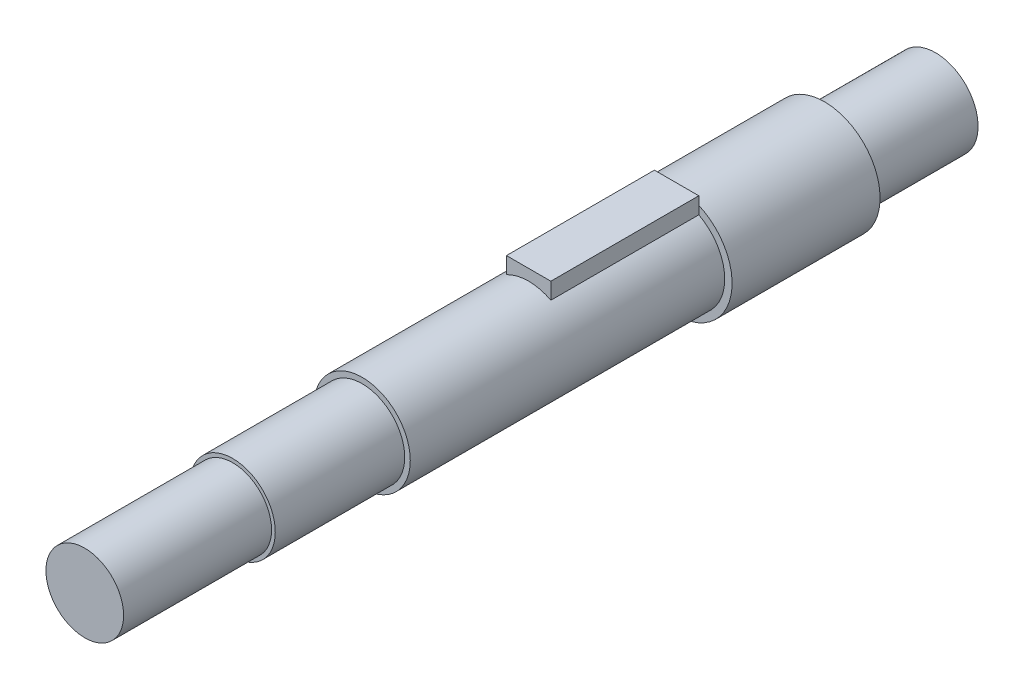
ISO-10303-21;
HEADER;
FILE_DESCRIPTION(('STEP AP214'),'2;1');
FILE_NAME('part.step','',(''),(''),'','','');
FILE_SCHEMA(('AUTOMOTIVE_DESIGN { 1 0 10303 214 1 1 1 1 }'));
ENDSEC;
DATA;
#1=APPLICATION_CONTEXT('core data for automotive mechanical design processes');
#2=APPLICATION_PROTOCOL_DEFINITION('international standard','automotive_design',2000,#1);
#3=PRODUCT_CONTEXT('',#1,'mechanical');
#4=PRODUCT('Part','Part','',(#3));
#5=PRODUCT_RELATED_PRODUCT_CATEGORY('part','',(#4));
#6=PRODUCT_DEFINITION_FORMATION('','',#4);
#7=PRODUCT_DEFINITION_CONTEXT('part definition',#1,'design');
#8=PRODUCT_DEFINITION('design','',#6,#7);
#9=PRODUCT_DEFINITION_SHAPE('','',#8);
#10=(LENGTH_UNIT() NAMED_UNIT(*) SI_UNIT(.MILLI.,.METRE.));
#11=(NAMED_UNIT(*) PLANE_ANGLE_UNIT() SI_UNIT($,.RADIAN.));
#12=(NAMED_UNIT(*) SI_UNIT($,.STERADIAN.) SOLID_ANGLE_UNIT());
#13=UNCERTAINTY_MEASURE_WITH_UNIT(LENGTH_MEASURE(1.E-05),#10,'distance_accuracy_value','');
#14=(GEOMETRIC_REPRESENTATION_CONTEXT(3) GLOBAL_UNCERTAINTY_ASSIGNED_CONTEXT((#13)) GLOBAL_UNIT_ASSIGNED_CONTEXT((#10,
#11,#12)) REPRESENTATION_CONTEXT('',''));
#15=CARTESIAN_POINT('',(0.,0.,0.));
#16=DIRECTION('',(0.,0.,1.));
#17=DIRECTION('',(1.,0.,0.));
#18=AXIS2_PLACEMENT_3D('',#15,#16,#17);
#19=CARTESIAN_POINT('',(0.,0.,70.));
#20=DIRECTION('',(0.,0.,1.));
#21=DIRECTION('',(1.,0.,0.));
#22=AXIS2_PLACEMENT_3D('',#19,#20,#21);
#23=CYLINDRICAL_SURFACE('',#22,13.);
#24=CARTESIAN_POINT('',(0.,0.,155.));
#25=DIRECTION('',(0.,0.,1.));
#26=DIRECTION('',(1.,0.,0.));
#27=AXIS2_PLACEMENT_3D('',#24,#25,#26);
#28=CIRCLE('',#27,13.);
#29=CARTESIAN_POINT('',(13.,0.,155.));
#30=VERTEX_POINT('',#29);
#31=EDGE_CURVE('E173',#30,#30,#28,.T.);
#32=ORIENTED_EDGE('',*,*,#31,.F.);
#33=EDGE_LOOP('',(#32));
#34=FACE_BOUND('',#33,.T.);
#35=CARTESIAN_POINT('',(0.,0.,110.));
#36=DIRECTION('',(0.,0.,-1.));
#37=DIRECTION('',(1.,0.,0.));
#38=AXIS2_PLACEMENT_3D('',#35,#36,#37);
#39=CIRCLE('',#38,13.);
#40=CARTESIAN_POINT('',(-6.,11.5325625946708,110.));
#41=VERTEX_POINT('',#40);
#42=CARTESIAN_POINT('',(6.,11.5325625946708,110.));
#43=VERTEX_POINT('',#42);
#44=EDGE_CURVE('E102',#41,#43,#39,.T.);
#45=ORIENTED_EDGE('',*,*,#44,.F.);
#46=DIRECTION('',(0.,0.,-1.));
#47=VECTOR('',#46,1.);
#48=CARTESIAN_POINT('',(-6.,11.5325625946708,110.));
#49=LINE('',#48,#47);
#50=CARTESIAN_POINT('',(-6.,11.5325625946708,70.));
#51=VERTEX_POINT('',#50);
#52=EDGE_CURVE('E112',#41,#51,#49,.T.);
#53=ORIENTED_EDGE('',*,*,#52,.T.);
#54=CARTESIAN_POINT('',(0.,0.,70.));
#55=DIRECTION('',(0.,0.,1.));
#56=DIRECTION('',(1.,0.,0.));
#57=AXIS2_PLACEMENT_3D('',#54,#55,#56);
#58=CIRCLE('',#57,13.);
#59=CARTESIAN_POINT('',(6.,11.5325625946708,70.));
#60=VERTEX_POINT('',#59);
#61=EDGE_CURVE('E177',#51,#60,#58,.T.);
#62=ORIENTED_EDGE('',*,*,#61,.T.);
#63=DIRECTION('',(0.,0.,-1.));
#64=VECTOR('',#63,1.);
#65=CARTESIAN_POINT('',(6.,11.5325625946708,110.));
#66=LINE('',#65,#64);
#67=EDGE_CURVE('E65',#43,#60,#66,.T.);
#68=ORIENTED_EDGE('',*,*,#67,.F.);
#69=EDGE_LOOP('',(#45,#53,#62,#68));
#70=FACE_BOUND('',#69,.T.);
#71=ADVANCED_FACE('F49',(#34,#70),#23,.T.);
#72=CARTESIAN_POINT('',(0.,0.,70.));
#73=DIRECTION('',(0.,0.,1.));
#74=DIRECTION('',(1.,0.,0.));
#75=AXIS2_PLACEMENT_3D('',#72,#73,#74);
#76=PLANE('',#75);
#77=ORIENTED_EDGE('',*,*,#61,.F.);
#78=DIRECTION('',(0.,1.,0.));
#79=VECTOR('',#78,1.);
#80=CARTESIAN_POINT('',(-6.,0.,70.));
#81=LINE('',#80,#79);
#82=CARTESIAN_POINT('',(-6.,13.7477270848675,70.));
#83=VERTEX_POINT('',#82);
#84=EDGE_CURVE('E12',#51,#83,#81,.T.);
#85=ORIENTED_EDGE('',*,*,#84,.T.);
#86=CARTESIAN_POINT('',(0.,0.,70.));
#87=DIRECTION('',(0.,0.,1.));
#88=DIRECTION('',(1.,0.,0.));
#89=AXIS2_PLACEMENT_3D('',#86,#87,#88);
#90=CIRCLE('',#89,15.);
#91=CARTESIAN_POINT('',(6.,13.7477270848675,70.));
#92=VERTEX_POINT('',#91);
#93=EDGE_CURVE('E179',#83,#92,#90,.T.);
#94=ORIENTED_EDGE('',*,*,#93,.T.);
#95=DIRECTION('',(0.,1.,0.));
#96=VECTOR('',#95,1.);
#97=CARTESIAN_POINT('',(6.,16.,70.));
#98=LINE('',#97,#96);
#99=EDGE_CURVE('E133',#60,#92,#98,.T.);
#100=ORIENTED_EDGE('',*,*,#99,.F.);
#101=EDGE_LOOP('',(#77,#85,#94,#100));
#102=FACE_BOUND('',#101,.T.);
#103=ADVANCED_FACE('F185',(#102),#76,.T.);
#104=CARTESIAN_POINT('',(0.,0.,230.));
#105=DIRECTION('',(0.,0.,-1.));
#106=DIRECTION('',(-1.,0.,0.));
#107=AXIS2_PLACEMENT_3D('',#104,#105,#106);
#108=CYLINDRICAL_SURFACE('',#107,15.);
#109=EDGE_CURVE('E58',#92,#83,#90,.T.);
#110=ORIENTED_EDGE('',*,*,#109,.F.);
#111=ORIENTED_EDGE('',*,*,#93,.F.);
#112=EDGE_LOOP('',(#110,#111));
#113=FACE_BOUND('',#112,.T.);
#114=CARTESIAN_POINT('',(0.,0.,30.));
#115=DIRECTION('',(0.,0.,-1.));
#116=DIRECTION('',(-1.,0.,0.));
#117=AXIS2_PLACEMENT_3D('',#114,#115,#116);
#118=CIRCLE('',#117,15.);
#119=CARTESIAN_POINT('',(-15.,0.,30.));
#120=VERTEX_POINT('',#119);
#121=EDGE_CURVE('E150',#120,#120,#118,.T.);
#122=ORIENTED_EDGE('',*,*,#121,.F.);
#123=EDGE_LOOP('',(#122));
#124=FACE_BOUND('',#123,.T.);
#125=ADVANCED_FACE('F51',(#113,#124),#108,.T.);
#126=CARTESIAN_POINT('',(0.,0.,155.));
#127=DIRECTION('',(0.,0.,1.));
#128=DIRECTION('',(1.,0.,0.));
#129=AXIS2_PLACEMENT_3D('',#126,#127,#128);
#130=CYLINDRICAL_SURFACE('',#129,11.5);
#131=CARTESIAN_POINT('',(0.,0.,155.));
#132=DIRECTION('',(0.,0.,1.));
#133=DIRECTION('',(1.,0.,0.));
#134=AXIS2_PLACEMENT_3D('',#131,#132,#133);
#135=CIRCLE('',#134,11.5);
#136=CARTESIAN_POINT('',(11.5,0.,155.));
#137=VERTEX_POINT('',#136);
#138=EDGE_CURVE('E169',#137,#137,#135,.T.);
#139=ORIENTED_EDGE('',*,*,#138,.T.);
#140=EDGE_LOOP('',(#139));
#141=FACE_BOUND('',#140,.T.);
#142=CARTESIAN_POINT('',(0.,0.,190.));
#143=DIRECTION('',(0.,0.,1.));
#144=DIRECTION('',(1.,0.,0.));
#145=AXIS2_PLACEMENT_3D('',#142,#143,#144);
#146=CIRCLE('',#145,11.5);
#147=CARTESIAN_POINT('',(11.5,0.,190.));
#148=VERTEX_POINT('',#147);
#149=EDGE_CURVE('E162',#148,#148,#146,.T.);
#150=ORIENTED_EDGE('',*,*,#149,.F.);
#151=EDGE_LOOP('',(#150));
#152=FACE_BOUND('',#151,.T.);
#153=ADVANCED_FACE('F189',(#141,#152),#130,.T.);
#154=CARTESIAN_POINT('',(0.,0.,155.));
#155=DIRECTION('',(0.,0.,1.));
#156=DIRECTION('',(1.,0.,0.));
#157=AXIS2_PLACEMENT_3D('',#154,#155,#156);
#158=PLANE('',#157);
#159=ORIENTED_EDGE('',*,*,#138,.F.);
#160=EDGE_LOOP('',(#159));
#161=FACE_BOUND('',#160,.T.);
#162=ORIENTED_EDGE('',*,*,#31,.T.);
#163=EDGE_LOOP('',(#162));
#164=FACE_BOUND('',#163,.T.);
#165=ADVANCED_FACE('F338',(#161,#164),#158,.T.);
#166=CARTESIAN_POINT('',(0.,0.,190.));
#167=DIRECTION('',(0.,0.,1.));
#168=DIRECTION('',(1.,0.,0.));
#169=AXIS2_PLACEMENT_3D('',#166,#167,#168);
#170=PLANE('',#169);
#171=CARTESIAN_POINT('',(0.,0.,190.));
#172=DIRECTION('',(0.,0.,1.));
#173=DIRECTION('',(1.,0.,0.));
#174=AXIS2_PLACEMENT_3D('',#171,#172,#173);
#175=CIRCLE('',#174,10.5);
#176=CARTESIAN_POINT('',(10.5,0.,190.));
#177=VERTEX_POINT('',#176);
#178=EDGE_CURVE('E158',#177,#177,#175,.T.);
#179=ORIENTED_EDGE('',*,*,#178,.F.);
#180=EDGE_LOOP('',(#179));
#181=FACE_BOUND('',#180,.T.);
#182=ORIENTED_EDGE('',*,*,#149,.T.);
#183=EDGE_LOOP('',(#182));
#184=FACE_BOUND('',#183,.T.);
#185=ADVANCED_FACE('F328',(#181,#184),#170,.T.);
#186=CARTESIAN_POINT('',(0.,0.,190.));
#187=DIRECTION('',(0.,0.,1.));
#188=DIRECTION('',(1.,0.,0.));
#189=AXIS2_PLACEMENT_3D('',#186,#187,#188);
#190=CYLINDRICAL_SURFACE('',#189,10.5);
#191=ORIENTED_EDGE('',*,*,#178,.T.);
#192=EDGE_LOOP('',(#191));
#193=FACE_BOUND('',#192,.T.);
#194=CARTESIAN_POINT('',(0.,0.,230.));
#195=DIRECTION('',(0.,0.,1.));
#196=DIRECTION('',(1.,0.,0.));
#197=AXIS2_PLACEMENT_3D('',#194,#195,#196);
#198=CIRCLE('',#197,10.5);
#199=CARTESIAN_POINT('',(10.5,0.,230.));
#200=VERTEX_POINT('',#199);
#201=EDGE_CURVE('E157',#200,#200,#198,.T.);
#202=ORIENTED_EDGE('',*,*,#201,.F.);
#203=EDGE_LOOP('',(#202));
#204=FACE_BOUND('',#203,.T.);
#205=ADVANCED_FACE('F205',(#193,#204),#190,.T.);
#206=CARTESIAN_POINT('',(0.,0.,230.));
#207=DIRECTION('',(0.,0.,1.));
#208=DIRECTION('',(1.,0.,0.));
#209=AXIS2_PLACEMENT_3D('',#206,#207,#208);
#210=PLANE('',#209);
#211=ORIENTED_EDGE('',*,*,#201,.T.);
#212=EDGE_LOOP('',(#211));
#213=FACE_BOUND('',#212,.T.);
#214=ADVANCED_FACE('F195',(#213),#210,.T.);
#215=CARTESIAN_POINT('',(0.,0.,30.));
#216=DIRECTION('',(0.,0.,-1.));
#217=DIRECTION('',(-1.,0.,0.));
#218=AXIS2_PLACEMENT_3D('',#215,#216,#217);
#219=PLANE('',#218);
#220=CARTESIAN_POINT('',(0.,0.,30.));
#221=DIRECTION('',(0.,0.,-1.));
#222=DIRECTION('',(-1.,0.,0.));
#223=AXIS2_PLACEMENT_3D('',#220,#221,#222);
#224=CIRCLE('',#223,11.5);
#225=CARTESIAN_POINT('',(-11.5,0.,30.));
#226=VERTEX_POINT('',#225);
#227=EDGE_CURVE('E146',#226,#226,#224,.T.);
#228=ORIENTED_EDGE('',*,*,#227,.F.);
#229=EDGE_LOOP('',(#228));
#230=FACE_BOUND('',#229,.T.);
#231=ORIENTED_EDGE('',*,*,#121,.T.);
#232=EDGE_LOOP('',(#231));
#233=FACE_BOUND('',#232,.T.);
#234=ADVANCED_FACE('F192',(#230,#233),#219,.T.);
#235=CARTESIAN_POINT('',(0.,0.,30.));
#236=DIRECTION('',(0.,0.,-1.));
#237=DIRECTION('',(-1.,0.,0.));
#238=AXIS2_PLACEMENT_3D('',#235,#236,#237);
#239=CYLINDRICAL_SURFACE('',#238,11.5);
#240=ORIENTED_EDGE('',*,*,#227,.T.);
#241=EDGE_LOOP('',(#240));
#242=FACE_BOUND('',#241,.T.);
#243=CARTESIAN_POINT('',(0.,0.,0.));
#244=DIRECTION('',(0.,0.,-1.));
#245=DIRECTION('',(-1.,0.,0.));
#246=AXIS2_PLACEMENT_3D('',#243,#244,#245);
#247=CIRCLE('',#246,11.5);
#248=CARTESIAN_POINT('',(-11.5,0.,0.));
#249=VERTEX_POINT('',#248);
#250=EDGE_CURVE('E118',#249,#249,#247,.T.);
#251=ORIENTED_EDGE('',*,*,#250,.F.);
#252=EDGE_LOOP('',(#251));
#253=FACE_BOUND('',#252,.T.);
#254=ADVANCED_FACE('F194',(#242,#253),#239,.T.);
#255=CARTESIAN_POINT('',(0.,0.,0.));
#256=DIRECTION('',(0.,0.,1.));
#257=DIRECTION('',(1.,0.,0.));
#258=AXIS2_PLACEMENT_3D('',#255,#256,#257);
#259=PLANE('',#258);
#260=ORIENTED_EDGE('',*,*,#250,.T.);
#261=EDGE_LOOP('',(#260));
#262=FACE_BOUND('',#261,.T.);
#263=ADVANCED_FACE('F202',(#262),#259,.F.);
#264=CARTESIAN_POINT('',(0.,0.,70.));
#265=DIRECTION('',(0.,0.,1.));
#266=DIRECTION('',(1.,0.,0.));
#267=AXIS2_PLACEMENT_3D('',#264,#265,#266);
#268=PLANE('',#267);
#269=CARTESIAN_POINT('',(6.,16.,70.));
#270=VERTEX_POINT('',#269);
#271=EDGE_CURVE('E132',#92,#270,#98,.T.);
#272=ORIENTED_EDGE('',*,*,#271,.F.);
#273=ORIENTED_EDGE('',*,*,#109,.T.);
#274=DIRECTION('',(0.,-1.,0.));
#275=VECTOR('',#274,1.);
#276=CARTESIAN_POINT('',(-6.,16.,70.));
#277=LINE('',#276,#275);
#278=CARTESIAN_POINT('',(-6.,16.,70.));
#279=VERTEX_POINT('',#278);
#280=EDGE_CURVE('E129',#279,#83,#277,.T.);
#281=ORIENTED_EDGE('',*,*,#280,.F.);
#282=DIRECTION('',(-1.,0.,0.));
#283=VECTOR('',#282,1.);
#284=CARTESIAN_POINT('',(-6.,16.,70.));
#285=LINE('',#284,#283);
#286=EDGE_CURVE('E109',#270,#279,#285,.T.);
#287=ORIENTED_EDGE('',*,*,#286,.F.);
#288=EDGE_LOOP('',(#272,#273,#281,#287));
#289=FACE_BOUND('',#288,.T.);
#290=ADVANCED_FACE('F221',(#289),#268,.F.);
#291=CARTESIAN_POINT('',(-6.,16.,110.));
#292=DIRECTION('',(1.,0.,0.));
#293=DIRECTION('',(0.,1.,0.));
#294=AXIS2_PLACEMENT_3D('',#291,#292,#293);
#295=PLANE('',#294);
#296=ORIENTED_EDGE('',*,*,#280,.T.);
#297=ORIENTED_EDGE('',*,*,#84,.F.);
#298=ORIENTED_EDGE('',*,*,#52,.F.);
#299=DIRECTION('',(0.,-1.,0.));
#300=VECTOR('',#299,1.);
#301=CARTESIAN_POINT('',(-6.,16.,110.));
#302=LINE('',#301,#300);
#303=CARTESIAN_POINT('',(-6.,16.,110.));
#304=VERTEX_POINT('',#303);
#305=EDGE_CURVE('E98',#304,#41,#302,.T.);
#306=ORIENTED_EDGE('',*,*,#305,.F.);
#307=DIRECTION('',(0.,0.,-1.));
#308=VECTOR('',#307,1.);
#309=CARTESIAN_POINT('',(-6.,16.,110.));
#310=LINE('',#309,#308);
#311=EDGE_CURVE('E128',#304,#279,#310,.T.);
#312=ORIENTED_EDGE('',*,*,#311,.T.);
#313=EDGE_LOOP('',(#296,#297,#298,#306,#312));
#314=FACE_BOUND('',#313,.T.);
#315=ADVANCED_FACE('F113',(#314),#295,.F.);
#316=CARTESIAN_POINT('',(6.,16.,110.));
#317=DIRECTION('',(-1.,0.,0.));
#318=DIRECTION('',(0.,-1.,0.));
#319=AXIS2_PLACEMENT_3D('',#316,#317,#318);
#320=PLANE('',#319);
#321=ORIENTED_EDGE('',*,*,#99,.T.);
#322=ORIENTED_EDGE('',*,*,#271,.T.);
#323=DIRECTION('',(0.,0.,-1.));
#324=VECTOR('',#323,1.);
#325=CARTESIAN_POINT('',(6.,16.,110.));
#326=LINE('',#325,#324);
#327=CARTESIAN_POINT('',(6.,16.,110.));
#328=VERTEX_POINT('',#327);
#329=EDGE_CURVE('E140',#328,#270,#326,.T.);
#330=ORIENTED_EDGE('',*,*,#329,.F.);
#331=DIRECTION('',(0.,1.,0.));
#332=VECTOR('',#331,1.);
#333=CARTESIAN_POINT('',(6.,16.,110.));
#334=LINE('',#333,#332);
#335=EDGE_CURVE('E121',#43,#328,#334,.T.);
#336=ORIENTED_EDGE('',*,*,#335,.F.);
#337=ORIENTED_EDGE('',*,*,#67,.T.);
#338=EDGE_LOOP('',(#321,#322,#330,#336,#337));
#339=FACE_BOUND('',#338,.T.);
#340=ADVANCED_FACE('F233',(#339),#320,.F.);
#341=CARTESIAN_POINT('',(-6.,16.,110.));
#342=DIRECTION('',(0.,-1.,0.));
#343=DIRECTION('',(0.,0.,-1.));
#344=AXIS2_PLACEMENT_3D('',#341,#342,#343);
#345=PLANE('',#344);
#346=ORIENTED_EDGE('',*,*,#286,.T.);
#347=ORIENTED_EDGE('',*,*,#311,.F.);
#348=DIRECTION('',(-1.,0.,0.));
#349=VECTOR('',#348,1.);
#350=CARTESIAN_POINT('',(-6.,16.,110.));
#351=LINE('',#350,#349);
#352=EDGE_CURVE('E104',#328,#304,#351,.T.);
#353=ORIENTED_EDGE('',*,*,#352,.F.);
#354=ORIENTED_EDGE('',*,*,#329,.T.);
#355=EDGE_LOOP('',(#346,#347,#353,#354));
#356=FACE_BOUND('',#355,.T.);
#357=ADVANCED_FACE('F237',(#356),#345,.F.);
#358=CARTESIAN_POINT('',(0.,0.,110.));
#359=DIRECTION('',(0.,0.,1.));
#360=DIRECTION('',(1.,0.,0.));
#361=AXIS2_PLACEMENT_3D('',#358,#359,#360);
#362=PLANE('',#361);
#363=ORIENTED_EDGE('',*,*,#305,.T.);
#364=ORIENTED_EDGE('',*,*,#44,.T.);
#365=ORIENTED_EDGE('',*,*,#335,.T.);
#366=ORIENTED_EDGE('',*,*,#352,.T.);
#367=EDGE_LOOP('',(#363,#364,#365,#366));
#368=FACE_BOUND('',#367,.T.);
#369=ADVANCED_FACE('F100',(#368),#362,.T.);
#370=CLOSED_SHELL('',(#71,#103,#125,#153,#165,#185,#205,#214,#234,#254,#263,#290,#315,#340,#357,#369));
#371=MANIFOLD_SOLID_BREP('B2',#370);
#372=ADVANCED_BREP_SHAPE_REPRESENTATION('',(#18,#371),#14);
#373=SHAPE_DEFINITION_REPRESENTATION(#9,#372);
ENDSEC;
END-ISO-10303-21;
